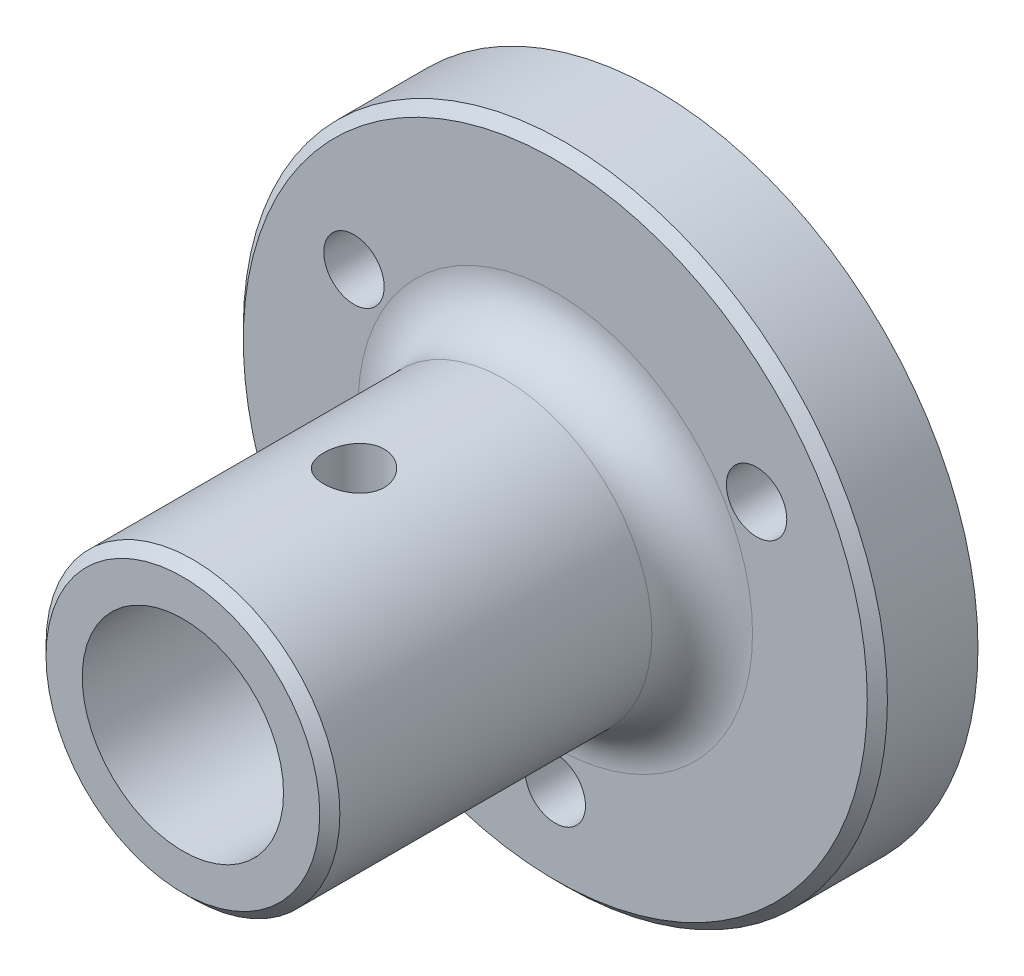
ISO-10303-21;
HEADER;
FILE_DESCRIPTION(('STEP AP214'),'2;1');
FILE_NAME('part.step','',(''),(''),'','','');
FILE_SCHEMA(('AUTOMOTIVE_DESIGN { 1 0 10303 214 1 1 1 1 }'));
ENDSEC;
DATA;
#1=APPLICATION_CONTEXT('core data for automotive mechanical design processes');
#2=APPLICATION_PROTOCOL_DEFINITION('international standard','automotive_design',2000,#1);
#3=PRODUCT_CONTEXT('',#1,'mechanical');
#4=PRODUCT('Part','Part','',(#3));
#5=PRODUCT_RELATED_PRODUCT_CATEGORY('part','',(#4));
#6=PRODUCT_DEFINITION_FORMATION('','',#4);
#7=PRODUCT_DEFINITION_CONTEXT('part definition',#1,'design');
#8=PRODUCT_DEFINITION('design','',#6,#7);
#9=PRODUCT_DEFINITION_SHAPE('','',#8);
#10=(LENGTH_UNIT() NAMED_UNIT(*) SI_UNIT(.MILLI.,.METRE.));
#11=(NAMED_UNIT(*) PLANE_ANGLE_UNIT() SI_UNIT($,.RADIAN.));
#12=(NAMED_UNIT(*) SI_UNIT($,.STERADIAN.) SOLID_ANGLE_UNIT());
#13=UNCERTAINTY_MEASURE_WITH_UNIT(LENGTH_MEASURE(1.E-05),#10,'distance_accuracy_value','');
#14=(GEOMETRIC_REPRESENTATION_CONTEXT(3) GLOBAL_UNCERTAINTY_ASSIGNED_CONTEXT((#13)) GLOBAL_UNIT_ASSIGNED_CONTEXT((#10,
#11,#12)) REPRESENTATION_CONTEXT('',''));
#15=CARTESIAN_POINT('',(0.,0.,0.));
#16=DIRECTION('',(0.,0.,1.));
#17=DIRECTION('',(1.,0.,0.));
#18=AXIS2_PLACEMENT_3D('',#15,#16,#17);
#19=CARTESIAN_POINT('',(0.,0.,10.));
#20=DIRECTION('',(0.,0.,1.));
#21=DIRECTION('',(1.,0.,0.));
#22=AXIS2_PLACEMENT_3D('',#19,#20,#21);
#23=PLANE('',#22);
#24=CARTESIAN_POINT('',(0.,0.,10.));
#25=DIRECTION('',(0.,0.,1.));
#26=DIRECTION('',(1.,0.,0.));
#27=AXIS2_PLACEMENT_3D('',#24,#25,#26);
#28=CIRCLE('',#27,31.);
#29=CARTESIAN_POINT('',(31.,0.,10.));
#30=VERTEX_POINT('',#29);
#31=EDGE_CURVE('E47',#30,#30,#28,.T.);
#32=ORIENTED_EDGE('',*,*,#31,.T.);
#33=EDGE_LOOP('',(#32));
#34=FACE_BOUND('',#33,.T.);
#35=CARTESIAN_POINT('',(0.,0.,10.));
#36=DIRECTION('',(0.,0.,1.));
#37=DIRECTION('',(1.,0.,0.));
#38=AXIS2_PLACEMENT_3D('',#35,#36,#37);
#39=CIRCLE('',#38,19.6);
#40=CARTESIAN_POINT('',(19.6,0.,10.));
#41=VERTEX_POINT('',#40);
#42=EDGE_CURVE('E63',#41,#41,#39,.F.);
#43=ORIENTED_EDGE('',*,*,#42,.T.);
#44=EDGE_LOOP('',(#43));
#45=FACE_BOUND('',#44,.T.);
#46=CARTESIAN_POINT('',(0.,-23.094010767585,10.));
#47=DIRECTION('',(0.,0.,1.));
#48=DIRECTION('',(1.,0.,0.));
#49=AXIS2_PLACEMENT_3D('',#46,#47,#48);
#50=CIRCLE('',#49,3.);
#51=CARTESIAN_POINT('',(3.,-23.094010767585,10.));
#52=VERTEX_POINT('',#51);
#53=EDGE_CURVE('E176',#52,#52,#50,.T.);
#54=ORIENTED_EDGE('',*,*,#53,.F.);
#55=EDGE_LOOP('',(#54));
#56=FACE_BOUND('',#55,.T.);
#57=CARTESIAN_POINT('',(20.,11.5470053837925,10.));
#58=DIRECTION('',(0.,0.,1.));
#59=DIRECTION('',(1.,0.,0.));
#60=AXIS2_PLACEMENT_3D('',#57,#58,#59);
#61=CIRCLE('',#60,3.);
#62=CARTESIAN_POINT('',(23.,11.5470053837925,10.));
#63=VERTEX_POINT('',#62);
#64=EDGE_CURVE('E184',#63,#63,#61,.T.);
#65=ORIENTED_EDGE('',*,*,#64,.F.);
#66=EDGE_LOOP('',(#65));
#67=FACE_BOUND('',#66,.T.);
#68=CARTESIAN_POINT('',(-20.,11.5470053837925,10.));
#69=DIRECTION('',(0.,0.,1.));
#70=DIRECTION('',(1.,0.,0.));
#71=AXIS2_PLACEMENT_3D('',#68,#69,#70);
#72=CIRCLE('',#71,3.);
#73=CARTESIAN_POINT('',(-17.,11.5470053837925,10.));
#74=VERTEX_POINT('',#73);
#75=EDGE_CURVE('E168',#74,#74,#72,.T.);
#76=ORIENTED_EDGE('',*,*,#75,.F.);
#77=EDGE_LOOP('',(#76));
#78=FACE_BOUND('',#77,.T.);
#79=ADVANCED_FACE('F38',(#34,#45,#56,#67,#78),#23,.T.);
#80=CARTESIAN_POINT('',(0.,0.,0.));
#81=DIRECTION('',(0.,0.,1.));
#82=DIRECTION('',(1.,0.,0.));
#83=AXIS2_PLACEMENT_3D('',#80,#81,#82);
#84=PLANE('',#83);
#85=CARTESIAN_POINT('',(0.,0.,0.));
#86=DIRECTION('',(0.,0.,1.));
#87=DIRECTION('',(1.,0.,0.));
#88=AXIS2_PLACEMENT_3D('',#85,#86,#87);
#89=CIRCLE('',#88,32.);
#90=CARTESIAN_POINT('',(32.,0.,0.));
#91=VERTEX_POINT('',#90);
#92=EDGE_CURVE('E188',#91,#91,#89,.T.);
#93=ORIENTED_EDGE('',*,*,#92,.F.);
#94=EDGE_LOOP('',(#93));
#95=FACE_BOUND('',#94,.T.);
#96=CARTESIAN_POINT('',(20.,11.5470053837925,0.));
#97=DIRECTION('',(0.,0.,1.));
#98=DIRECTION('',(1.,0.,0.));
#99=AXIS2_PLACEMENT_3D('',#96,#97,#98);
#100=CIRCLE('',#99,3.);
#101=CARTESIAN_POINT('',(23.,11.5470053837925,0.));
#102=VERTEX_POINT('',#101);
#103=EDGE_CURVE('E180',#102,#102,#100,.T.);
#104=ORIENTED_EDGE('',*,*,#103,.T.);
#105=EDGE_LOOP('',(#104));
#106=FACE_BOUND('',#105,.T.);
#107=CARTESIAN_POINT('',(0.,-23.094010767585,0.));
#108=DIRECTION('',(0.,0.,1.));
#109=DIRECTION('',(1.,0.,0.));
#110=AXIS2_PLACEMENT_3D('',#107,#108,#109);
#111=CIRCLE('',#110,3.);
#112=CARTESIAN_POINT('',(3.,-23.094010767585,0.));
#113=VERTEX_POINT('',#112);
#114=EDGE_CURVE('E174',#113,#113,#111,.T.);
#115=ORIENTED_EDGE('',*,*,#114,.T.);
#116=EDGE_LOOP('',(#115));
#117=FACE_BOUND('',#116,.T.);
#118=CARTESIAN_POINT('',(-20.,11.5470053837925,0.));
#119=DIRECTION('',(0.,0.,1.));
#120=DIRECTION('',(1.,0.,0.));
#121=AXIS2_PLACEMENT_3D('',#118,#119,#120);
#122=CIRCLE('',#121,3.);
#123=CARTESIAN_POINT('',(-17.,11.5470053837925,0.));
#124=VERTEX_POINT('',#123);
#125=EDGE_CURVE('E164',#124,#124,#122,.T.);
#126=ORIENTED_EDGE('',*,*,#125,.T.);
#127=EDGE_LOOP('',(#126));
#128=FACE_BOUND('',#127,.T.);
#129=ADVANCED_FACE('F134',(#95,#106,#117,#128),#84,.F.);
#130=CARTESIAN_POINT('',(0.,0.,10.));
#131=DIRECTION('',(0.,0.,-1.));
#132=DIRECTION('',(-1.,0.,0.));
#133=AXIS2_PLACEMENT_3D('',#130,#131,#132);
#134=CYLINDRICAL_SURFACE('',#133,32.);
#135=CARTESIAN_POINT('',(0.,0.,9.00000000000001));
#136=DIRECTION('',(0.,0.,1.));
#137=DIRECTION('',(1.,0.,0.));
#138=AXIS2_PLACEMENT_3D('',#135,#136,#137);
#139=CIRCLE('',#138,32.);
#140=CARTESIAN_POINT('',(32.,0.,9.00000000000001));
#141=VERTEX_POINT('',#140);
#142=EDGE_CURVE('E10',#141,#141,#139,.F.);
#143=ORIENTED_EDGE('',*,*,#142,.T.);
#144=EDGE_LOOP('',(#143));
#145=FACE_BOUND('',#144,.T.);
#146=ORIENTED_EDGE('',*,*,#92,.T.);
#147=EDGE_LOOP('',(#146));
#148=FACE_BOUND('',#147,.T.);
#149=ADVANCED_FACE('F130',(#145,#148),#134,.T.);
#150=CARTESIAN_POINT('',(20.,11.5470053837925,10.));
#151=DIRECTION('',(0.,0.,-1.));
#152=DIRECTION('',(-1.,0.,0.));
#153=AXIS2_PLACEMENT_3D('',#150,#151,#152);
#154=CYLINDRICAL_SURFACE('',#153,3.);
#155=ORIENTED_EDGE('',*,*,#64,.T.);
#156=EDGE_LOOP('',(#155));
#157=FACE_BOUND('',#156,.T.);
#158=ORIENTED_EDGE('',*,*,#103,.F.);
#159=EDGE_LOOP('',(#158));
#160=FACE_BOUND('',#159,.T.);
#161=ADVANCED_FACE('F126',(#157,#160),#154,.F.);
#162=CARTESIAN_POINT('',(0.,-23.094010767585,10.));
#163=DIRECTION('',(0.,0.,-1.));
#164=DIRECTION('',(-1.,0.,0.));
#165=AXIS2_PLACEMENT_3D('',#162,#163,#164);
#166=CYLINDRICAL_SURFACE('',#165,3.);
#167=ORIENTED_EDGE('',*,*,#53,.T.);
#168=EDGE_LOOP('',(#167));
#169=FACE_BOUND('',#168,.T.);
#170=ORIENTED_EDGE('',*,*,#114,.F.);
#171=EDGE_LOOP('',(#170));
#172=FACE_BOUND('',#171,.T.);
#173=ADVANCED_FACE('F122',(#169,#172),#166,.F.);
#174=CARTESIAN_POINT('',(-20.,11.5470053837925,10.));
#175=DIRECTION('',(0.,0.,-1.));
#176=DIRECTION('',(-1.,0.,0.));
#177=AXIS2_PLACEMENT_3D('',#174,#175,#176);
#178=CYLINDRICAL_SURFACE('',#177,3.);
#179=ORIENTED_EDGE('',*,*,#75,.T.);
#180=EDGE_LOOP('',(#179));
#181=FACE_BOUND('',#180,.T.);
#182=ORIENTED_EDGE('',*,*,#125,.F.);
#183=EDGE_LOOP('',(#182));
#184=FACE_BOUND('',#183,.T.);
#185=ADVANCED_FACE('F118',(#181,#184),#178,.F.);
#186=CARTESIAN_POINT('',(0.,0.,47.));
#187=DIRECTION('',(0.,0.,1.));
#188=DIRECTION('',(1.,0.,0.));
#189=AXIS2_PLACEMENT_3D('',#186,#187,#188);
#190=PLANE('',#189);
#191=CARTESIAN_POINT('',(0.,0.,47.));
#192=DIRECTION('',(0.,0.,1.));
#193=DIRECTION('',(1.,0.,0.));
#194=AXIS2_PLACEMENT_3D('',#191,#192,#193);
#195=CIRCLE('',#194,13.6);
#196=CARTESIAN_POINT('',(13.6,0.,47.));
#197=VERTEX_POINT('',#196);
#198=EDGE_CURVE('E57',#197,#197,#195,.T.);
#199=ORIENTED_EDGE('',*,*,#198,.T.);
#200=EDGE_LOOP('',(#199));
#201=FACE_BOUND('',#200,.T.);
#202=CARTESIAN_POINT('',(0.,0.,47.));
#203=DIRECTION('',(0.,0.,1.));
#204=DIRECTION('',(1.,0.,0.));
#205=AXIS2_PLACEMENT_3D('',#202,#203,#204);
#206=CIRCLE('',#205,10.);
#207=CARTESIAN_POINT('',(10.,0.,47.));
#208=VERTEX_POINT('',#207);
#209=EDGE_CURVE('E161',#208,#208,#206,.T.);
#210=ORIENTED_EDGE('',*,*,#209,.F.);
#211=EDGE_LOOP('',(#210));
#212=FACE_BOUND('',#211,.T.);
#213=ADVANCED_FACE('F116',(#201,#212),#190,.T.);
#214=CARTESIAN_POINT('',(0.,0.,47.));
#215=DIRECTION('',(0.,0.,-1.));
#216=DIRECTION('',(-1.,0.,0.));
#217=AXIS2_PLACEMENT_3D('',#214,#215,#216);
#218=CYLINDRICAL_SURFACE('',#217,14.6);
#219=CARTESIAN_POINT('',(0.,0.,46.));
#220=DIRECTION('',(0.,0.,1.));
#221=DIRECTION('',(1.,0.,0.));
#222=AXIS2_PLACEMENT_3D('',#219,#220,#221);
#223=CIRCLE('',#222,14.6);
#224=CARTESIAN_POINT('',(14.6,0.,46.));
#225=VERTEX_POINT('',#224);
#226=EDGE_CURVE('E52',#225,#225,#223,.F.);
#227=ORIENTED_EDGE('',*,*,#226,.T.);
#228=EDGE_LOOP('',(#227));
#229=FACE_BOUND('',#228,.T.);
#230=CARTESIAN_POINT('',(0.,0.,15.));
#231=DIRECTION('',(0.,0.,1.));
#232=DIRECTION('',(1.,0.,0.));
#233=AXIS2_PLACEMENT_3D('',#230,#231,#232);
#234=CIRCLE('',#233,14.6);
#235=CARTESIAN_POINT('',(14.6,0.,15.));
#236=VERTEX_POINT('',#235);
#237=EDGE_CURVE('E67',#236,#236,#234,.T.);
#238=ORIENTED_EDGE('',*,*,#237,.T.);
#239=EDGE_LOOP('',(#238));
#240=FACE_BOUND('',#239,.T.);
#241=CARTESIAN_POINT('',(0.,-14.6,33.));
#242=CARTESIAN_POINT('',(0.166633377005212,-14.5999969182109,32.9999939875564));
#243=CARTESIAN_POINT('',(0.333341784113638,-14.5971180613124,32.9860697584777));
#244=CARTESIAN_POINT('',(0.662039861848744,-14.5859115188509,32.9307888195421));
#245=CARTESIAN_POINT('',(0.824025789869709,-14.577579628086,32.8894109379845));
#246=CARTESIAN_POINT('',(1.13847954897907,-14.5563966332869,32.780560211012));
#247=CARTESIAN_POINT('',(1.2909565623748,-14.5435499710842,32.7131130072606));
#248=CARTESIAN_POINT('',(1.58242115066612,-14.5147311294236,32.5541159148074));
#249=CARTESIAN_POINT('',(1.72140939815028,-14.4987591059252,32.4625672287208));
#250=CARTESIAN_POINT('',(1.98394160788817,-14.4651905104871,32.2565829450867));
#251=CARTESIAN_POINT('',(2.10726561222999,-14.4475757932375,32.141869935958));
#252=CARTESIAN_POINT('',(2.33306326838937,-14.412837915702,31.8934094140278));
#253=CARTESIAN_POINT('',(2.43553522882711,-14.3957147953879,31.7596603586423));
#254=CARTESIAN_POINT('',(2.61766595214403,-14.3637212074771,31.4753296483046));
#255=CARTESIAN_POINT('',(2.69709513793058,-14.3488740607833,31.3245980786085));
#256=CARTESIAN_POINT('',(2.82941433253285,-14.3233719815213,31.0115725218656));
#257=CARTESIAN_POINT('',(2.8823071178752,-14.3127166103891,30.8492797465079));
#258=CARTESIAN_POINT('',(2.95933433606094,-14.2969884735749,30.5201108694876));
#259=CARTESIAN_POINT('',(2.98385570508323,-14.2918406692852,30.3533289725136));
#260=CARTESIAN_POINT('',(3.00464624392415,-14.2874848040001,30.0179450611205));
#261=CARTESIAN_POINT('',(3.0009184668875,-14.2882761011115,29.8493432453635));
#262=CARTESIAN_POINT('',(2.96562895838244,-14.2956409222609,29.5179492318097));
#263=CARTESIAN_POINT('',(2.93451246175025,-14.3021219488913,29.3551072581875));
#264=CARTESIAN_POINT('',(2.84603232070754,-14.3199901686138,29.0370053022098));
#265=CARTESIAN_POINT('',(2.788667360196,-14.3313776077122,28.8817457004674));
#266=CARTESIAN_POINT('',(2.64889819518435,-14.3578691706868,28.5819415738694));
#267=CARTESIAN_POINT('',(2.56631901964995,-14.3729991213359,28.4374809975888));
#268=CARTESIAN_POINT('',(2.37858887523347,-14.4052545768745,28.164300952785));
#269=CARTESIAN_POINT('',(2.27343517443706,-14.4223803231755,28.0355833924057));
#270=CARTESIAN_POINT('',(2.04116471520823,-14.4570973640614,27.7949756900215));
#271=CARTESIAN_POINT('',(1.91366834489734,-14.4746913188376,27.6834520676003));
#272=CARTESIAN_POINT('',(1.6415892274147,-14.5080646509021,27.4833146880252));
#273=CARTESIAN_POINT('',(1.497006237179,-14.5238440023708,27.3947012568349));
#274=CARTESIAN_POINT('',(1.19443953148626,-14.5518523717957,27.2428254573483));
#275=CARTESIAN_POINT('',(1.03643331110215,-14.564075269061,27.1796067232555));
#276=CARTESIAN_POINT('',(0.711735220012306,-14.5835473921338,27.080714994033));
#277=CARTESIAN_POINT('',(0.545044463968483,-14.5907972545475,27.0450384731067));
#278=CARTESIAN_POINT('',(0.210857036553482,-14.5994172317983,27.0027668224685));
#279=CARTESIAN_POINT('',(0.0434263131154535,-14.60088869373,26.9956703709297));
#280=CARTESIAN_POINT('',(-0.290228334883841,-14.5980682869987,27.0094077144487));
#281=CARTESIAN_POINT('',(-0.456452330641598,-14.5937767611742,27.0302398480418));
#282=CARTESIAN_POINT('',(-0.781345314395099,-14.5799761514448,27.0988267155744));
#283=CARTESIAN_POINT('',(-0.940071267549889,-14.5705172562301,27.1463225953927));
#284=CARTESIAN_POINT('',(-1.2473055703844,-14.5474391036697,27.266604595902));
#285=CARTESIAN_POINT('',(-1.3958131223451,-14.5338195219626,27.3393926884004));
#286=CARTESIAN_POINT('',(-1.68049762867288,-14.5036789258417,27.5092660638503));
#287=CARTESIAN_POINT('',(-1.81649193589808,-14.4871229279649,27.6066510980625));
#288=CARTESIAN_POINT('',(-2.0703883746622,-14.453024989171,27.8225545013176));
#289=CARTESIAN_POINT('',(-2.18828844796234,-14.4354829363987,27.9410752712632));
#290=CARTESIAN_POINT('',(-2.40459801034589,-14.4010459459494,28.1981733703916));
#291=CARTESIAN_POINT('',(-2.50266245744593,-14.3841660094418,28.3370433643473));
#292=CARTESIAN_POINT('',(-2.67407551033463,-14.3532901068317,28.6295783187771));
#293=CARTESIAN_POINT('',(-2.74742513211914,-14.3392940221867,28.7832426707394));
#294=CARTESIAN_POINT('',(-2.8668637794127,-14.3158932892074,29.1002127631897));
#295=CARTESIAN_POINT('',(-2.91309804599263,-14.3064642262667,29.2634618855721));
#296=CARTESIAN_POINT('',(-2.97743018185563,-14.2932154447435,29.5956274258376));
#297=CARTESIAN_POINT('',(-2.99553195177979,-14.2893949485232,29.7645430547269));
#298=CARTESIAN_POINT('',(-3.00293466093762,-14.2878407207398,30.0997784419471));
#299=CARTESIAN_POINT('',(-2.99278131823603,-14.2899916552887,30.2660858528177));
#300=CARTESIAN_POINT('',(-2.94517085564493,-14.2998793491826,30.5945673762651));
#301=CARTESIAN_POINT('',(-2.90771398269054,-14.3076160580094,30.7567415262097));
#302=CARTESIAN_POINT('',(-2.80680901965499,-14.327750658765,31.07198125967));
#303=CARTESIAN_POINT('',(-2.74343141015598,-14.3401359034906,31.2250702638829));
#304=CARTESIAN_POINT('',(-2.59254816370386,-14.3681786066726,31.5185262787084));
#305=CARTESIAN_POINT('',(-2.50504036139108,-14.3838363587618,31.6588921460882));
#306=CARTESIAN_POINT('',(-2.30653215096687,-14.4170103674048,31.9256271589619));
#307=CARTESIAN_POINT('',(-2.19513908694041,-14.4345548855488,32.0517006234524));
#308=CARTESIAN_POINT('',(-1.95282895906888,-14.4693265333104,32.283545746749));
#309=CARTESIAN_POINT('',(-1.82190740982401,-14.4865535889878,32.3893127286628));
#310=CARTESIAN_POINT('',(-1.54249946162867,-14.518976373148,32.5786617062105));
#311=CARTESIAN_POINT('',(-1.39383336889653,-14.5341472904643,32.6619829852152));
#312=CARTESIAN_POINT('',(-1.08433553229311,-14.5605030609518,32.8023265749854));
#313=CARTESIAN_POINT('',(-0.923514686494789,-14.5716914346961,32.8593721267084));
#314=CARTESIAN_POINT('',(-0.63532265935256,-14.5866978320433,32.9347450580274));
#315=CARTESIAN_POINT('',(-0.509570139843861,-14.5916564747335,32.959171179745));
#316=CARTESIAN_POINT('',(-0.255893112768169,-14.5983086847068,32.9918006744142));
#317=CARTESIAN_POINT('',(-0.127968681672888,-14.6000023667077,33.0000046173491));
#318=CARTESIAN_POINT('',(0.,-14.6,33.));
#319=B_SPLINE_CURVE_WITH_KNOTS('',3,(#241,#242,#243,#244,#245,#246,#247,#248,#249,#250,#251,
#252,#253,#254,#255,#256,#257,#258,#259,#260,#261,#262,#263,#264,#265,#266,#267,#268,#269,#270,
#271,#272,#273,#274,#275,#276,#277,#278,#279,#280,#281,#282,#283,#284,#285,#286,#287,#288,#289,
#290,#291,#292,#293,#294,#295,#296,#297,#298,#299,#300,#301,#302,#303,#304,#305,#306,#307,#308,
#309,#310,#311,#312,#313,#314,#315,#316,#317,#318),.UNSPECIFIED.,.T.,.F.,(4,2,2,2,2,2,2,2,2,2,2,
2,2,2,2,2,2,2,2,2,2,2,2,2,2,2,2,2,2,2,2,2,2,2,2,2,2,2,4),(0.,0.499431908281444,
0.999249416697518,1.49857655289747,1.99787877840735,2.50355891165817,3.00928004599943,
3.51987909004206,4.03042469851552,4.53392208786281,5.03736506039832,5.53277208571102,
6.02820395351141,6.5271551089866,7.0261666803933,7.53466708974391,8.04317473358533,
8.55255241650952,9.06186488099989,9.56220355268085,10.062512460659,10.558046287335,
11.0536187550179,11.5555494146976,12.0575371272846,12.5676215565365,13.0776850142902,
13.5849908007719,14.0922262417588,14.5897333171287,15.0872358930642,15.5833946187815,
16.0795978825561,16.5846874900775,17.0898932882465,17.6007363468644,18.1111266915164,
18.494686634662,18.878233100783),.UNSPECIFIED.);
#320=CARTESIAN_POINT('',(0.,-14.6,33.));
#321=VERTEX_POINT('',#320);
#322=EDGE_CURVE('E107',#321,#321,#319,.T.);
#323=ORIENTED_EDGE('',*,*,#322,.T.);
#324=EDGE_LOOP('',(#323));
#325=FACE_BOUND('',#324,.T.);
#326=CARTESIAN_POINT('',(0.,14.6,33.));
#327=CARTESIAN_POINT('',(-0.166633377005208,14.5999969182109,32.9999939875564));
#328=CARTESIAN_POINT('',(-0.333341784113635,14.5971180613124,32.9860697584777));
#329=CARTESIAN_POINT('',(-0.66203986184874,14.5859115188509,32.9307888195421));
#330=CARTESIAN_POINT('',(-0.824025789869706,14.577579628086,32.8894109379845));
#331=CARTESIAN_POINT('',(-1.13847954897906,14.5563966332869,32.780560211012));
#332=CARTESIAN_POINT('',(-1.2909565623748,14.5435499710842,32.7131130072606));
#333=CARTESIAN_POINT('',(-1.58242115066612,14.5147311294236,32.5541159148074));
#334=CARTESIAN_POINT('',(-1.72140939815028,14.4987591059252,32.4625672287208));
#335=CARTESIAN_POINT('',(-1.98394160788816,14.4651905104871,32.2565829450867));
#336=CARTESIAN_POINT('',(-2.10726561222998,14.4475757932375,32.141869935958));
#337=CARTESIAN_POINT('',(-2.33306326838936,14.412837915702,31.8934094140278));
#338=CARTESIAN_POINT('',(-2.43553522882711,14.3957147953878,31.7596603586423));
#339=CARTESIAN_POINT('',(-2.61766595214403,14.3637212074771,31.4753296483046));
#340=CARTESIAN_POINT('',(-2.69709513793058,14.3488740607834,31.3245980786085));
#341=CARTESIAN_POINT('',(-2.82941433253285,14.3233719815213,31.0115725218656));
#342=CARTESIAN_POINT('',(-2.88230711787519,14.3127166103891,30.8492797465079));
#343=CARTESIAN_POINT('',(-2.95933433606094,14.2969884735749,30.5201108694876));
#344=CARTESIAN_POINT('',(-2.98385570508322,14.2918406692852,30.3533289725136));
#345=CARTESIAN_POINT('',(-3.00464624392415,14.2874848040001,30.0179450611205));
#346=CARTESIAN_POINT('',(-3.0009184668875,14.2882761011115,29.8493432453635));
#347=CARTESIAN_POINT('',(-2.96562895838243,14.2956409222609,29.5179492318097));
#348=CARTESIAN_POINT('',(-2.93451246175025,14.3021219488913,29.3551072581875));
#349=CARTESIAN_POINT('',(-2.84603232070753,14.3199901686138,29.0370053022098));
#350=CARTESIAN_POINT('',(-2.788667360196,14.3313776077122,28.8817457004674));
#351=CARTESIAN_POINT('',(-2.64889819518435,14.3578691706868,28.5819415738694));
#352=CARTESIAN_POINT('',(-2.56631901964995,14.3729991213359,28.4374809975888));
#353=CARTESIAN_POINT('',(-2.37858887523346,14.4052545768745,28.164300952785));
#354=CARTESIAN_POINT('',(-2.27343517443705,14.4223803231755,28.0355833924057));
#355=CARTESIAN_POINT('',(-2.04116471520823,14.4570973640614,27.7949756900215));
#356=CARTESIAN_POINT('',(-1.91366834489734,14.4746913188376,27.6834520676003));
#357=CARTESIAN_POINT('',(-1.64158922741469,14.5080646509021,27.4833146880252));
#358=CARTESIAN_POINT('',(-1.49700623717899,14.5238440023708,27.3947012568349));
#359=CARTESIAN_POINT('',(-1.19443953148626,14.5518523717957,27.2428254573483));
#360=CARTESIAN_POINT('',(-1.03643331110215,14.564075269061,27.1796067232555));
#361=CARTESIAN_POINT('',(-0.711735220012305,14.5835473921338,27.080714994033));
#362=CARTESIAN_POINT('',(-0.545044463968481,14.5907972545475,27.0450384731067));
#363=CARTESIAN_POINT('',(-0.21085703655348,14.5994172317983,27.0027668224685));
#364=CARTESIAN_POINT('',(-0.0434263131154516,14.60088869373,26.9956703709297));
#365=CARTESIAN_POINT('',(0.290228334883843,14.5980682869987,27.0094077144487));
#366=CARTESIAN_POINT('',(0.4564523306416,14.5937767611742,27.0302398480418));
#367=CARTESIAN_POINT('',(0.781345314395101,14.5799761514448,27.0988267155744));
#368=CARTESIAN_POINT('',(0.94007126754989,14.5705172562301,27.1463225953927));
#369=CARTESIAN_POINT('',(1.2473055703844,14.5474391036697,27.266604595902));
#370=CARTESIAN_POINT('',(1.3958131223451,14.5338195219626,27.3393926884004));
#371=CARTESIAN_POINT('',(1.68049762867289,14.5036789258417,27.5092660638503));
#372=CARTESIAN_POINT('',(1.81649193589808,14.4871229279649,27.6066510980625));
#373=CARTESIAN_POINT('',(2.0703883746622,14.453024989171,27.8225545013176));
#374=CARTESIAN_POINT('',(2.18828844796235,14.4354829363987,27.9410752712632));
#375=CARTESIAN_POINT('',(2.40459801034589,14.4010459459494,28.1981733703916));
#376=CARTESIAN_POINT('',(2.50266245744593,14.3841660094418,28.3370433643473));
#377=CARTESIAN_POINT('',(2.67407551033463,14.3532901068317,28.629578318777));
#378=CARTESIAN_POINT('',(2.74742513211914,14.3392940221867,28.7832426707394));
#379=CARTESIAN_POINT('',(2.86686377941271,14.3158932892074,29.1002127631897));
#380=CARTESIAN_POINT('',(2.91309804599263,14.3064642262667,29.2634618855721));
#381=CARTESIAN_POINT('',(2.97743018185563,14.2932154447435,29.5956274258376));
#382=CARTESIAN_POINT('',(2.9955319517798,14.2893949485232,29.7645430547269));
#383=CARTESIAN_POINT('',(3.00293466093763,14.2878407207398,30.0997784419471));
#384=CARTESIAN_POINT('',(2.99278131823603,14.2899916552887,30.2660858528177));
#385=CARTESIAN_POINT('',(2.94517085564493,14.2998793491826,30.5945673762651));
#386=CARTESIAN_POINT('',(2.90771398269055,14.3076160580094,30.7567415262097));
#387=CARTESIAN_POINT('',(2.80680901965499,14.327750658765,31.07198125967));
#388=CARTESIAN_POINT('',(2.74343141015599,14.3401359034906,31.2250702638829));
#389=CARTESIAN_POINT('',(2.59254816370386,14.3681786066725,31.5185262787084));
#390=CARTESIAN_POINT('',(2.50504036139109,14.3838363587618,31.6588921460882));
#391=CARTESIAN_POINT('',(2.30653215096687,14.4170103674048,31.9256271589619));
#392=CARTESIAN_POINT('',(2.19513908694042,14.4345548855488,32.0517006234524));
#393=CARTESIAN_POINT('',(1.95282895906888,14.4693265333104,32.283545746749));
#394=CARTESIAN_POINT('',(1.82190740982402,14.4865535889878,32.3893127286628));
#395=CARTESIAN_POINT('',(1.54249946162868,14.518976373148,32.5786617062105));
#396=CARTESIAN_POINT('',(1.39383336889653,14.5341472904643,32.6619829852152));
#397=CARTESIAN_POINT('',(1.08433553229311,14.5605030609518,32.8023265749854));
#398=CARTESIAN_POINT('',(0.923514686494793,14.5716914346961,32.8593721267084));
#399=CARTESIAN_POINT('',(0.635322659352563,14.5866978320433,32.9347450580274));
#400=CARTESIAN_POINT('',(0.509570139843864,14.5916564747335,32.959171179745));
#401=CARTESIAN_POINT('',(0.255893112768173,14.5983086847068,32.9918006744142));
#402=CARTESIAN_POINT('',(0.127968681672891,14.6000023667077,33.0000046173491));
#403=CARTESIAN_POINT('',(0.,14.6,33.));
#404=B_SPLINE_CURVE_WITH_KNOTS('',3,(#326,#327,#328,#329,#330,#331,#332,#333,#334,#335,#336,
#337,#338,#339,#340,#341,#342,#343,#344,#345,#346,#347,#348,#349,#350,#351,#352,#353,#354,#355,
#356,#357,#358,#359,#360,#361,#362,#363,#364,#365,#366,#367,#368,#369,#370,#371,#372,#373,#374,
#375,#376,#377,#378,#379,#380,#381,#382,#383,#384,#385,#386,#387,#388,#389,#390,#391,#392,#393,
#394,#395,#396,#397,#398,#399,#400,#401,#402,#403),.UNSPECIFIED.,.T.,.F.,(4,2,2,2,2,2,2,2,2,2,2,
2,2,2,2,2,2,2,2,2,2,2,2,2,2,2,2,2,2,2,2,2,2,2,2,2,2,2,4),(0.,0.499431908281443,
0.999249416697518,1.49857655289746,1.99787877840735,2.50355891165816,3.00928004599943,
3.51987909004206,4.03042469851552,4.53392208786281,5.03736506039832,5.53277208571102,
6.02820395351141,6.5271551089866,7.0261666803933,7.5346670897439,8.04317473358533,
8.55255241650952,9.06186488099989,9.56220355268085,10.062512460659,10.558046287335,
11.0536187550179,11.5555494146976,12.0575371272846,12.5676215565365,13.0776850142902,
13.5849908007718,14.0922262417588,14.5897333171287,15.0872358930642,15.5833946187815,
16.0795978825561,16.5846874900775,17.0898932882465,17.6007363468644,18.1111266915164,
18.494686634662,18.878233100783),.UNSPECIFIED.);
#405=CARTESIAN_POINT('',(0.,14.6,33.));
#406=VERTEX_POINT('',#405);
#407=EDGE_CURVE('E81',#406,#406,#404,.T.);
#408=ORIENTED_EDGE('',*,*,#407,.T.);
#409=EDGE_LOOP('',(#408));
#410=FACE_BOUND('',#409,.T.);
#411=ADVANCED_FACE('F112',(#229,#240,#325,#410),#218,.T.);
#412=CARTESIAN_POINT('',(0.,0.,47.));
#413=DIRECTION('',(0.,0.,-1.));
#414=DIRECTION('',(-1.,0.,0.));
#415=AXIS2_PLACEMENT_3D('',#412,#413,#414);
#416=CYLINDRICAL_SURFACE('',#415,10.);
#417=CARTESIAN_POINT('',(0.,-10.,33.));
#418=CARTESIAN_POINT('',(0.164577225506601,-9.99999858501101,32.9999980050302));
#419=CARTESIAN_POINT('',(0.32917463670306,-9.99589831387907,32.9864122727521));
#420=CARTESIAN_POINT('',(0.653576250609762,-9.97994211187382,32.9325572915558));
#421=CARTESIAN_POINT('',(0.813379008822841,-9.96808386779384,32.8922800839533));
#422=CARTESIAN_POINT('',(1.12346541550905,-9.93791105003673,32.7865079661795));
#423=CARTESIAN_POINT('',(1.27376272879075,-9.91960600500851,32.7210502607621));
#424=CARTESIAN_POINT('',(1.56124836210626,-9.87844218475291,32.5669278138883));
#425=CARTESIAN_POINT('',(1.69843493493934,-9.85558280384133,32.4782599852092));
#426=CARTESIAN_POINT('',(1.95974359436749,-9.80701474385548,32.2775519850547));
#427=CARTESIAN_POINT('',(2.08343614248868,-9.78124767314073,32.1649667482282));
#428=CARTESIAN_POINT('',(2.31049841846648,-9.73011668420884,31.9207815401796));
#429=CARTESIAN_POINT('',(2.41386472654882,-9.70475283449003,31.7891783757501));
#430=CARTESIAN_POINT('',(2.59960075447416,-9.65668227987544,31.5070584939248));
#431=CARTESIAN_POINT('',(2.68144618044427,-9.63404813327749,31.3561830780185));
#432=CARTESIAN_POINT('',(2.81842789549521,-9.59487240788062,31.0420214915394));
#433=CARTESIAN_POINT('',(2.87357059839947,-9.57832936626621,30.878738312144));
#434=CARTESIAN_POINT('',(2.95403267365304,-9.55381741676868,30.5492194677391));
#435=CARTESIAN_POINT('',(2.98014392469355,-9.54562138649067,30.3831945122721));
#436=CARTESIAN_POINT('',(3.00427461229344,-9.53805579499534,30.0489336875665));
#437=CARTESIAN_POINT('',(3.00230085522157,-9.53868409521142,29.8806983638818));
#438=CARTESIAN_POINT('',(2.97093954399624,-9.54849488135555,29.553232182783));
#439=CARTESIAN_POINT('',(2.94254410525371,-9.55736777198281,29.3938954992755));
#440=CARTESIAN_POINT('',(2.86074840854112,-9.58216712457248,29.0823604274531));
#441=CARTESIAN_POINT('',(2.80734568283282,-9.59809428264701,28.9301627452513));
#442=CARTESIAN_POINT('',(2.67632053307364,-9.63545466149946,28.6347993006785));
#443=CARTESIAN_POINT('',(2.59837633869285,-9.65696032231904,28.4917858320895));
#444=CARTESIAN_POINT('',(2.42070445177367,-9.70301974000129,28.2205359559796));
#445=CARTESIAN_POINT('',(2.32097148005177,-9.72757423493982,28.0923031411724));
#446=CARTESIAN_POINT('',(2.09762581531093,-9.77822022595875,27.848627618476));
#447=CARTESIAN_POINT('',(1.97318981493395,-9.80433308620996,27.7339426719407));
#448=CARTESIAN_POINT('',(1.70652651862794,-9.85424488126517,27.5268920318715));
#449=CARTESIAN_POINT('',(1.56429810372178,-9.8780436703682,27.4345277431711));
#450=CARTESIAN_POINT('',(1.26471007668561,-9.92086320138941,27.2742801550705));
#451=CARTESIAN_POINT('',(1.1072554994959,-9.93985087336628,27.2065649675003));
#452=CARTESIAN_POINT('',(0.78249083120704,-9.97067043664444,27.0988008198007));
#453=CARTESIAN_POINT('',(0.615183503179165,-9.98250432373999,27.058744142935));
#454=CARTESIAN_POINT('',(0.281904485336665,-9.99736729287077,27.0086956442012));
#455=CARTESIAN_POINT('',(0.116100195202376,-10.0006970083558,26.9976768283968));
#456=CARTESIAN_POINT('',(-0.214999211646764,-9.99905846483519,27.0031383114242));
#457=CARTESIAN_POINT('',(-0.380294393381559,-9.99409131355514,27.0196149393029));
#458=CARTESIAN_POINT('',(-0.701807210619391,-9.97661393974325,27.078769222223));
#459=CARTESIAN_POINT('',(-0.858145545228336,-9.96427659598829,27.1208467751617));
#460=CARTESIAN_POINT('',(-1.16150927790904,-9.9334869568307,27.2292864655564));
#461=CARTESIAN_POINT('',(-1.30853355405117,-9.91503392642188,27.2956515220757));
#462=CARTESIAN_POINT('',(-1.5928743789221,-9.87339308702631,27.4525063309623));
#463=CARTESIAN_POINT('',(-1.72988765239933,-9.8501056165928,27.543518681896));
#464=CARTESIAN_POINT('',(-1.9870466159603,-9.80146937528705,27.7464495081056));
#465=CARTESIAN_POINT('',(-2.10718806471188,-9.7761200886242,27.8583732237753));
#466=CARTESIAN_POINT('',(-2.33171489102052,-9.72506343738007,28.1047746167387));
#467=CARTESIAN_POINT('',(-2.43536962463001,-9.69937650065513,28.2399237515436));
#468=CARTESIAN_POINT('',(-2.61857990144313,-9.65153030477949,28.5262558780269));
#469=CARTESIAN_POINT('',(-2.69813607658965,-9.62937095313121,28.6774384491158));
#470=CARTESIAN_POINT('',(-2.83034694254316,-9.5913437922631,28.99106498251));
#471=CARTESIAN_POINT('',(-2.88312693874021,-9.575446756735,29.1534523730757));
#472=CARTESIAN_POINT('',(-2.96043461630306,-9.55183188739737,29.4853759378605));
#473=CARTESIAN_POINT('',(-2.98497197957849,-9.54411125069387,29.6549096415661));
#474=CARTESIAN_POINT('',(-3.0044396896993,-9.53799944941558,29.9887230367768));
#475=CARTESIAN_POINT('',(-3.00056110615887,-9.53923294700395,30.1529273020988));
#476=CARTESIAN_POINT('',(-2.9661501088861,-9.54998802392188,30.4782282068012));
#477=CARTESIAN_POINT('',(-2.93561876249408,-9.55950927135902,30.639324970361));
#478=CARTESIAN_POINT('',(-2.84953777608686,-9.58551527389243,30.9518907982633));
#479=CARTESIAN_POINT('',(-2.79430351014248,-9.60191209104934,31.1034545747174));
#480=CARTESIAN_POINT('',(-2.66063014242147,-9.63980557805265,31.3952848776414));
#481=CARTESIAN_POINT('',(-2.58218659925722,-9.6613032238508,31.5355492352831));
#482=CARTESIAN_POINT('',(-2.40097527610176,-9.70795352855338,31.8063262330525));
#483=CARTESIAN_POINT('',(-2.29742552185996,-9.7332108032858,31.9362975225204));
#484=CARTESIAN_POINT('',(-2.07034869259555,-9.78402640899066,32.1774049966162));
#485=CARTESIAN_POINT('',(-1.94681643426898,-9.80958481647543,32.2885362789356));
#486=CARTESIAN_POINT('',(-1.67893152436652,-9.85901873141573,32.4920468245899));
#487=CARTESIAN_POINT('',(-1.53407577158122,-9.88282319531422,32.5837828937109));
#488=CARTESIAN_POINT('',(-1.23028274796705,-9.92521360911553,32.7414703398081));
#489=CARTESIAN_POINT('',(-1.07135210599791,-9.94380199862114,32.807433776549));
#490=CARTESIAN_POINT('',(-0.761515425310563,-9.97204349938619,32.9057905513055));
#491=CARTESIAN_POINT('',(-0.611573923908468,-9.9824405476214,32.9410233457665));
#492=CARTESIAN_POINT('',(-0.307760390461557,-9.9964188898898,32.9881270504832));
#493=CARTESIAN_POINT('',(-0.153889019716278,-10.0000013230948,33.0000018654096));
#494=CARTESIAN_POINT('',(0.,-10.,33.));
#495=B_SPLINE_CURVE_WITH_KNOTS('',3,(#417,#418,#419,#420,#421,#422,#423,#424,#425,#426,#427,
#428,#429,#430,#431,#432,#433,#434,#435,#436,#437,#438,#439,#440,#441,#442,#443,#444,#445,#446,
#447,#448,#449,#450,#451,#452,#453,#454,#455,#456,#457,#458,#459,#460,#461,#462,#463,#464,#465,
#466,#467,#468,#469,#470,#471,#472,#473,#474,#475,#476,#477,#478,#479,#480,#481,#482,#483,#484,
#485,#486,#487,#488,#489,#490,#491,#492,#493,#494),.UNSPECIFIED.,.T.,.F.,(4,2,2,2,2,2,2,2,2,2,2,
2,2,2,2,2,2,2,2,2,2,2,2,2,2,2,2,2,2,2,2,2,2,2,2,2,2,2,4),(0.,0.49316640722522,0.986479929691999,
1.47906735260175,1.9717203288254,2.47711205896383,2.98258874577266,3.49942962008219,
4.01614629086447,4.51839378713197,5.02051956638178,5.50452033395351,5.98856887316002,
6.47924852894239,6.97004720317111,7.48134208096333,7.99266913062143,8.50742093763377,
9.02202907057615,9.5181761887709,10.0142570710065,10.4991349336465,10.9840710918746,
11.4802261140582,11.9765056400038,12.4908080064564,13.0050968850536,13.516956299025,
14.0286401892057,14.5190031093854,15.0093463933232,15.4936008081456,15.9779479511533,
16.4799385136898,16.9820594980412,17.4988599232246,18.0154182319959,18.4766338387004,
18.9377723390687),.UNSPECIFIED.);
#496=CARTESIAN_POINT('',(0.,-10.,33.));
#497=VERTEX_POINT('',#496);
#498=EDGE_CURVE('E72',#497,#497,#495,.T.);
#499=ORIENTED_EDGE('',*,*,#498,.F.);
#500=EDGE_LOOP('',(#499));
#501=FACE_BOUND('',#500,.T.);
#502=CARTESIAN_POINT('',(0.,10.,33.));
#503=CARTESIAN_POINT('',(-0.164577225506597,9.99999858501101,32.9999980050302));
#504=CARTESIAN_POINT('',(-0.329174636703056,9.99589831387907,32.9864122727521));
#505=CARTESIAN_POINT('',(-0.653576250609758,9.97994211187382,32.9325572915558));
#506=CARTESIAN_POINT('',(-0.813379008822837,9.96808386779384,32.8922800839533));
#507=CARTESIAN_POINT('',(-1.12346541550905,9.93791105003673,32.7865079661795));
#508=CARTESIAN_POINT('',(-1.27376272879074,9.91960600500851,32.7210502607621));
#509=CARTESIAN_POINT('',(-1.56124836210626,9.87844218475291,32.5669278138883));
#510=CARTESIAN_POINT('',(-1.69843493493933,9.85558280384133,32.4782599852092));
#511=CARTESIAN_POINT('',(-1.95974359436748,9.80701474385548,32.2775519850547));
#512=CARTESIAN_POINT('',(-2.08343614248868,9.78124767314073,32.1649667482282));
#513=CARTESIAN_POINT('',(-2.31049841846647,9.73011668420884,31.9207815401796));
#514=CARTESIAN_POINT('',(-2.41386472654881,9.70475283449003,31.7891783757501));
#515=CARTESIAN_POINT('',(-2.59960075447415,9.65668227987544,31.5070584939248));
#516=CARTESIAN_POINT('',(-2.68144618044426,9.6340481332775,31.3561830780185));
#517=CARTESIAN_POINT('',(-2.8184278954952,9.59487240788062,31.0420214915394));
#518=CARTESIAN_POINT('',(-2.87357059839946,9.57832936626621,30.8787383121441));
#519=CARTESIAN_POINT('',(-2.95403267365303,9.55381741676868,30.5492194677391));
#520=CARTESIAN_POINT('',(-2.98014392469355,9.54562138649067,30.3831945122721));
#521=CARTESIAN_POINT('',(-3.00427461229344,9.53805579499534,30.0489336875665));
#522=CARTESIAN_POINT('',(-3.00230085522157,9.53868409521142,29.8806983638818));
#523=CARTESIAN_POINT('',(-2.97093954399623,9.54849488135555,29.553232182783));
#524=CARTESIAN_POINT('',(-2.9425441052537,9.55736777198281,29.3938954992755));
#525=CARTESIAN_POINT('',(-2.86074840854112,9.58216712457248,29.0823604274531));
#526=CARTESIAN_POINT('',(-2.80734568283282,9.59809428264701,28.9301627452513));
#527=CARTESIAN_POINT('',(-2.67632053307363,9.63545466149946,28.6347993006785));
#528=CARTESIAN_POINT('',(-2.59837633869285,9.65696032231904,28.4917858320895));
#529=CARTESIAN_POINT('',(-2.42070445177367,9.70301974000129,28.2205359559796));
#530=CARTESIAN_POINT('',(-2.32097148005177,9.72757423493982,28.0923031411724));
#531=CARTESIAN_POINT('',(-2.09762581531093,9.77822022595875,27.848627618476));
#532=CARTESIAN_POINT('',(-1.97318981493394,9.80433308620996,27.7339426719407));
#533=CARTESIAN_POINT('',(-1.70652651862793,9.85424488126517,27.5268920318715));
#534=CARTESIAN_POINT('',(-1.56429810372178,9.8780436703682,27.4345277431711));
#535=CARTESIAN_POINT('',(-1.26471007668561,9.92086320138941,27.2742801550705));
#536=CARTESIAN_POINT('',(-1.1072554994959,9.93985087336628,27.2065649675003));
#537=CARTESIAN_POINT('',(-0.782490831207041,9.97067043664444,27.0988008198007));
#538=CARTESIAN_POINT('',(-0.615183503179165,9.98250432373999,27.058744142935));
#539=CARTESIAN_POINT('',(-0.281904485336664,9.99736729287077,27.0086956442012));
#540=CARTESIAN_POINT('',(-0.116100195202375,10.0006970083558,26.9976768283968));
#541=CARTESIAN_POINT('',(0.214999211646765,9.99905846483519,27.0031383114242));
#542=CARTESIAN_POINT('',(0.380294393381561,9.99409131355514,27.0196149393029));
#543=CARTESIAN_POINT('',(0.701807210619393,9.97661393974325,27.078769222223));
#544=CARTESIAN_POINT('',(0.858145545228338,9.96427659598829,27.1208467751617));
#545=CARTESIAN_POINT('',(1.16150927790904,9.9334869568307,27.2292864655564));
#546=CARTESIAN_POINT('',(1.30853355405117,9.91503392642188,27.2956515220757));
#547=CARTESIAN_POINT('',(1.5928743789221,9.87339308702631,27.4525063309623));
#548=CARTESIAN_POINT('',(1.72988765239934,9.8501056165928,27.543518681896));
#549=CARTESIAN_POINT('',(1.9870466159603,9.80146937528704,27.7464495081056));
#550=CARTESIAN_POINT('',(2.10718806471188,9.7761200886242,27.8583732237753));
#551=CARTESIAN_POINT('',(2.33171489102052,9.72506343738007,28.1047746167387));
#552=CARTESIAN_POINT('',(2.43536962463002,9.69937650065513,28.2399237515436));
#553=CARTESIAN_POINT('',(2.61857990144313,9.65153030477949,28.5262558780269));
#554=CARTESIAN_POINT('',(2.69813607658965,9.62937095313121,28.6774384491158));
#555=CARTESIAN_POINT('',(2.83034694254316,9.5913437922631,28.99106498251));
#556=CARTESIAN_POINT('',(2.88312693874022,9.575446756735,29.1534523730757));
#557=CARTESIAN_POINT('',(2.96043461630306,9.55183188739737,29.4853759378605));
#558=CARTESIAN_POINT('',(2.98497197957849,9.54411125069387,29.6549096415661));
#559=CARTESIAN_POINT('',(3.0044396896993,9.53799944941558,29.9887230367768));
#560=CARTESIAN_POINT('',(3.00056110615887,9.53923294700395,30.1529273020988));
#561=CARTESIAN_POINT('',(2.96615010888611,9.54998802392188,30.4782282068012));
#562=CARTESIAN_POINT('',(2.93561876249408,9.55950927135901,30.639324970361));
#563=CARTESIAN_POINT('',(2.84953777608686,9.58551527389243,30.9518907982633));
#564=CARTESIAN_POINT('',(2.79430351014248,9.60191209104934,31.1034545747174));
#565=CARTESIAN_POINT('',(2.66063014242148,9.63980557805265,31.3952848776414));
#566=CARTESIAN_POINT('',(2.58218659925723,9.6613032238508,31.5355492352831));
#567=CARTESIAN_POINT('',(2.40097527610176,9.70795352855338,31.8063262330525));
#568=CARTESIAN_POINT('',(2.29742552185996,9.7332108032858,31.9362975225204));
#569=CARTESIAN_POINT('',(2.07034869259556,9.78402640899066,32.1774049966162));
#570=CARTESIAN_POINT('',(1.94681643426898,9.80958481647543,32.2885362789356));
#571=CARTESIAN_POINT('',(1.67893152436652,9.85901873141573,32.4920468245899));
#572=CARTESIAN_POINT('',(1.53407577158123,9.88282319531421,32.5837828937109));
#573=CARTESIAN_POINT('',(1.23028274796706,9.92521360911553,32.7414703398081));
#574=CARTESIAN_POINT('',(1.07135210599791,9.94380199862114,32.807433776549));
#575=CARTESIAN_POINT('',(0.761515425310568,9.97204349938619,32.9057905513055));
#576=CARTESIAN_POINT('',(0.611573923908473,9.9824405476214,32.9410233457665));
#577=CARTESIAN_POINT('',(0.307760390461562,9.9964188898898,32.9881270504832));
#578=CARTESIAN_POINT('',(0.153889019716282,10.0000013230948,33.0000018654096));
#579=CARTESIAN_POINT('',(0.,10.,33.));
#580=B_SPLINE_CURVE_WITH_KNOTS('',3,(#502,#503,#504,#505,#506,#507,#508,#509,#510,#511,#512,
#513,#514,#515,#516,#517,#518,#519,#520,#521,#522,#523,#524,#525,#526,#527,#528,#529,#530,#531,
#532,#533,#534,#535,#536,#537,#538,#539,#540,#541,#542,#543,#544,#545,#546,#547,#548,#549,#550,
#551,#552,#553,#554,#555,#556,#557,#558,#559,#560,#561,#562,#563,#564,#565,#566,#567,#568,#569,
#570,#571,#572,#573,#574,#575,#576,#577,#578,#579),.UNSPECIFIED.,.T.,.F.,(4,2,2,2,2,2,2,2,2,2,2,
2,2,2,2,2,2,2,2,2,2,2,2,2,2,2,2,2,2,2,2,2,2,2,2,2,2,2,4),(0.,0.493166407225219,
0.986479929691999,1.47906735260175,1.9717203288254,2.47711205896382,2.98258874577265,
3.49942962008217,4.01614629086447,4.51839378713197,5.02051956638179,5.50452033395353,
5.98856887316002,6.47924852894239,6.97004720317111,7.48134208096333,7.99266913062143,
8.50742093763377,9.02202907057615,9.5181761887709,10.0142570710065,10.4991349336465,
10.9840710918746,11.4802261140582,11.9765056400038,12.4908080064564,13.0050968850536,
13.516956299025,14.0286401892057,14.5190031093854,15.0093463933232,15.4936008081456,
15.9779479511533,16.4799385136898,16.9820594980413,17.4988599232246,18.0154182319959,
18.4766338387004,18.9377723390687),.UNSPECIFIED.);
#581=CARTESIAN_POINT('',(0.,10.,33.));
#582=VERTEX_POINT('',#581);
#583=EDGE_CURVE('E82',#582,#582,#580,.T.);
#584=ORIENTED_EDGE('',*,*,#583,.F.);
#585=EDGE_LOOP('',(#584));
#586=FACE_BOUND('',#585,.T.);
#587=ORIENTED_EDGE('',*,*,#209,.T.);
#588=EDGE_LOOP('',(#587));
#589=FACE_BOUND('',#588,.T.);
#590=CARTESIAN_POINT('',(0.,0.,10.));
#591=DIRECTION('',(0.,0.,1.));
#592=DIRECTION('',(1.,0.,0.));
#593=AXIS2_PLACEMENT_3D('',#590,#591,#592);
#594=CIRCLE('',#593,10.);
#595=CARTESIAN_POINT('',(10.,0.,10.));
#596=VERTEX_POINT('',#595);
#597=EDGE_CURVE('E71',#596,#596,#594,.F.);
#598=ORIENTED_EDGE('',*,*,#597,.T.);
#599=EDGE_LOOP('',(#598));
#600=FACE_BOUND('',#599,.T.);
#601=ADVANCED_FACE('F87',(#501,#586,#589,#600),#416,.F.);
#602=ORIENTED_EDGE('',*,*,#597,.F.);
#603=EDGE_LOOP('',(#602));
#604=FACE_BOUND('',#603,.T.);
#605=ADVANCED_FACE('F135',(#604),#23,.T.);
#606=CARTESIAN_POINT('',(0.,-32.,30.));
#607=DIRECTION('',(0.,1.,0.));
#608=DIRECTION('',(0.,0.,1.));
#609=AXIS2_PLACEMENT_3D('',#606,#607,#608);
#610=CYLINDRICAL_SURFACE('',#609,3.);
#611=ORIENTED_EDGE('',*,*,#583,.T.);
#612=EDGE_LOOP('',(#611));
#613=FACE_BOUND('',#612,.T.);
#614=ORIENTED_EDGE('',*,*,#407,.F.);
#615=EDGE_LOOP('',(#614));
#616=FACE_BOUND('',#615,.T.);
#617=ADVANCED_FACE('F94',(#613,#616),#610,.F.);
#618=ORIENTED_EDGE('',*,*,#498,.T.);
#619=EDGE_LOOP('',(#618));
#620=FACE_BOUND('',#619,.T.);
#621=ORIENTED_EDGE('',*,*,#322,.F.);
#622=EDGE_LOOP('',(#621));
#623=FACE_BOUND('',#622,.T.);
#624=ADVANCED_FACE('F90',(#620,#623),#610,.F.);
#625=CARTESIAN_POINT('',(0.,0.,15.));
#626=DIRECTION('',(0.,0.,1.));
#627=DIRECTION('',(1.,0.,0.));
#628=AXIS2_PLACEMENT_3D('',#625,#626,#627);
#629=TOROIDAL_SURFACE('',#628,19.6,5.);
#630=ORIENTED_EDGE('',*,*,#42,.F.);
#631=EDGE_LOOP('',(#630));
#632=FACE_BOUND('',#631,.T.);
#633=ORIENTED_EDGE('',*,*,#237,.F.);
#634=EDGE_LOOP('',(#633));
#635=FACE_BOUND('',#634,.T.);
#636=ADVANCED_FACE('F93',(#632,#635),#629,.F.);
#637=CARTESIAN_POINT('',(0.,0.,47.));
#638=DIRECTION('',(0.,0.,-1.));
#639=DIRECTION('',(-1.,0.,0.));
#640=AXIS2_PLACEMENT_3D('',#637,#638,#639);
#641=CONICAL_SURFACE('',#640,13.6,0.785398163397444);
#642=ORIENTED_EDGE('',*,*,#226,.F.);
#643=EDGE_LOOP('',(#642));
#644=FACE_BOUND('',#643,.T.);
#645=ORIENTED_EDGE('',*,*,#198,.F.);
#646=EDGE_LOOP('',(#645));
#647=FACE_BOUND('',#646,.T.);
#648=ADVANCED_FACE('F142',(#644,#647),#641,.T.);
#649=CARTESIAN_POINT('',(0.,0.,10.));
#650=DIRECTION('',(0.,0.,-1.));
#651=DIRECTION('',(-1.,0.,0.));
#652=AXIS2_PLACEMENT_3D('',#649,#650,#651);
#653=CONICAL_SURFACE('',#652,31.,0.785398163397434);
#654=ORIENTED_EDGE('',*,*,#142,.F.);
#655=EDGE_LOOP('',(#654));
#656=FACE_BOUND('',#655,.T.);
#657=ORIENTED_EDGE('',*,*,#31,.F.);
#658=EDGE_LOOP('',(#657));
#659=FACE_BOUND('',#658,.T.);
#660=ADVANCED_FACE('F41',(#656,#659),#653,.T.);
#661=CLOSED_SHELL('',(#79,#129,#149,#161,#173,#185,#213,#411,#601,#605,#617,#624,#636,#648,#660));
#662=MANIFOLD_SOLID_BREP('B2',#661);
#663=ADVANCED_BREP_SHAPE_REPRESENTATION('',(#18,#662),#14);
#664=SHAPE_DEFINITION_REPRESENTATION(#9,#663);
ENDSEC;
END-ISO-10303-21;
